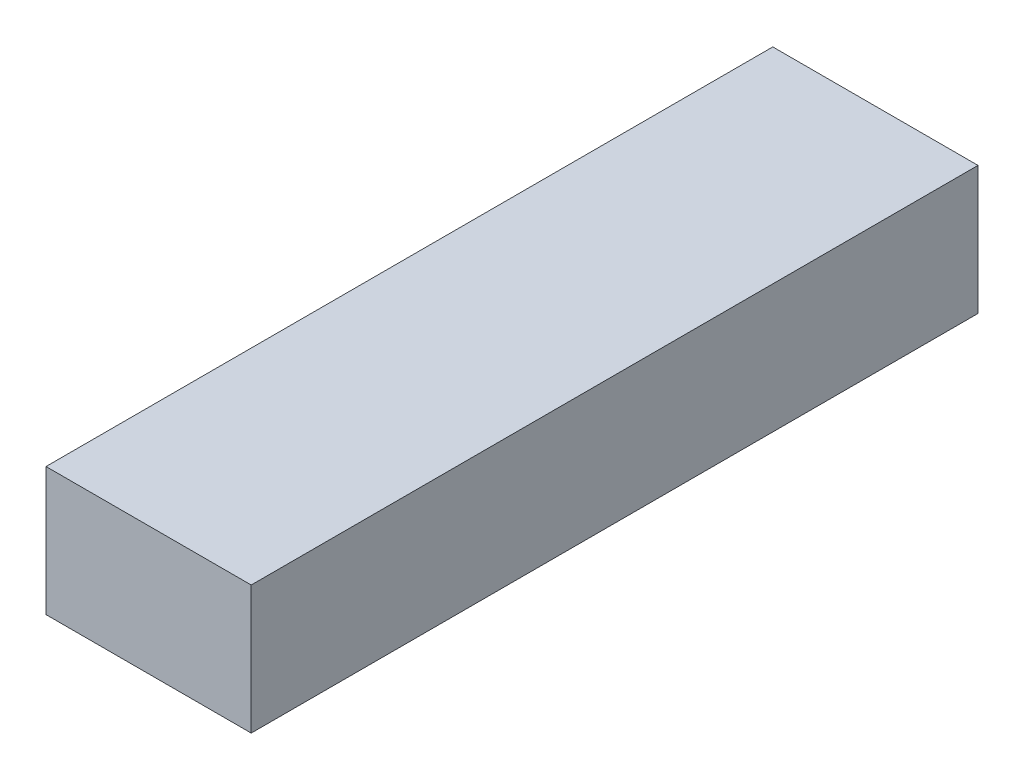
ISO-10303-21;
HEADER;
FILE_DESCRIPTION(('STEP AP214'),'2;1');
FILE_NAME('part.step','',(''),(''),'','','');
FILE_SCHEMA(('AUTOMOTIVE_DESIGN { 1 0 10303 214 1 1 1 1 }'));
ENDSEC;
DATA;
#1=APPLICATION_CONTEXT('core data for automotive mechanical design processes');
#2=APPLICATION_PROTOCOL_DEFINITION('international standard','automotive_design',2000,#1);
#3=PRODUCT_CONTEXT('',#1,'mechanical');
#4=PRODUCT('Part','Part','',(#3));
#5=PRODUCT_RELATED_PRODUCT_CATEGORY('part','',(#4));
#6=PRODUCT_DEFINITION_FORMATION('','',#4);
#7=PRODUCT_DEFINITION_CONTEXT('part definition',#1,'design');
#8=PRODUCT_DEFINITION('design','',#6,#7);
#9=PRODUCT_DEFINITION_SHAPE('','',#8);
#10=(LENGTH_UNIT() NAMED_UNIT(*) SI_UNIT(.MILLI.,.METRE.));
#11=(NAMED_UNIT(*) PLANE_ANGLE_UNIT() SI_UNIT($,.RADIAN.));
#12=(NAMED_UNIT(*) SI_UNIT($,.STERADIAN.) SOLID_ANGLE_UNIT());
#13=UNCERTAINTY_MEASURE_WITH_UNIT(LENGTH_MEASURE(1.E-05),#10,'distance_accuracy_value','');
#14=(GEOMETRIC_REPRESENTATION_CONTEXT(3) GLOBAL_UNCERTAINTY_ASSIGNED_CONTEXT((#13)) GLOBAL_UNIT_ASSIGNED_CONTEXT((#10,
#11,#12)) REPRESENTATION_CONTEXT('',''));
#15=CARTESIAN_POINT('',(0.,0.,0.));
#16=DIRECTION('',(0.,0.,1.));
#17=DIRECTION('',(1.,0.,0.));
#18=AXIS2_PLACEMENT_3D('',#15,#16,#17);
#19=CARTESIAN_POINT('',(24.,15.,170.));
#20=DIRECTION('',(-1.,0.,0.));
#21=DIRECTION('',(0.,0.,1.));
#22=AXIS2_PLACEMENT_3D('',#19,#20,#21);
#23=PLANE('',#22);
#24=DIRECTION('',(0.,1.,0.));
#25=VECTOR('',#24,1.);
#26=CARTESIAN_POINT('',(24.,15.,0.));
#27=LINE('',#26,#25);
#28=CARTESIAN_POINT('',(24.,-15.,0.));
#29=VERTEX_POINT('',#28);
#30=CARTESIAN_POINT('',(24.,15.,0.));
#31=VERTEX_POINT('',#30);
#32=EDGE_CURVE('E104',#29,#31,#27,.T.);
#33=ORIENTED_EDGE('',*,*,#32,.T.);
#34=DIRECTION('',(0.,0.,-1.));
#35=VECTOR('',#34,1.);
#36=CARTESIAN_POINT('',(24.,15.,170.));
#37=LINE('',#36,#35);
#38=CARTESIAN_POINT('',(24.,15.,170.));
#39=VERTEX_POINT('',#38);
#40=EDGE_CURVE('E11',#39,#31,#37,.T.);
#41=ORIENTED_EDGE('',*,*,#40,.F.);
#42=DIRECTION('',(0.,1.,0.));
#43=VECTOR('',#42,1.);
#44=CARTESIAN_POINT('',(24.,15.,170.));
#45=LINE('',#44,#43);
#46=CARTESIAN_POINT('',(24.,-15.,170.));
#47=VERTEX_POINT('',#46);
#48=EDGE_CURVE('E92',#47,#39,#45,.T.);
#49=ORIENTED_EDGE('',*,*,#48,.F.);
#50=DIRECTION('',(0.,0.,-1.));
#51=VECTOR('',#50,1.);
#52=CARTESIAN_POINT('',(24.,-15.,170.));
#53=LINE('',#52,#51);
#54=EDGE_CURVE('E100',#47,#29,#53,.T.);
#55=ORIENTED_EDGE('',*,*,#54,.T.);
#56=EDGE_LOOP('',(#33,#41,#49,#55));
#57=FACE_BOUND('',#56,.T.);
#58=ADVANCED_FACE('F41',(#57),#23,.F.);
#59=CARTESIAN_POINT('',(-24.,15.,170.));
#60=DIRECTION('',(0.,-1.,0.));
#61=DIRECTION('',(0.,0.,-1.));
#62=AXIS2_PLACEMENT_3D('',#59,#60,#61);
#63=PLANE('',#62);
#64=DIRECTION('',(-1.,0.,0.));
#65=VECTOR('',#64,1.);
#66=CARTESIAN_POINT('',(-24.,15.,0.));
#67=LINE('',#66,#65);
#68=CARTESIAN_POINT('',(-24.,15.,0.));
#69=VERTEX_POINT('',#68);
#70=EDGE_CURVE('E96',#31,#69,#67,.T.);
#71=ORIENTED_EDGE('',*,*,#70,.T.);
#72=DIRECTION('',(0.,0.,-1.));
#73=VECTOR('',#72,1.);
#74=CARTESIAN_POINT('',(-24.,15.,170.));
#75=LINE('',#74,#73);
#76=CARTESIAN_POINT('',(-24.,15.,170.));
#77=VERTEX_POINT('',#76);
#78=EDGE_CURVE('E49',#77,#69,#75,.T.);
#79=ORIENTED_EDGE('',*,*,#78,.F.);
#80=DIRECTION('',(-1.,0.,0.));
#81=VECTOR('',#80,1.);
#82=CARTESIAN_POINT('',(-24.,15.,170.));
#83=LINE('',#82,#81);
#84=EDGE_CURVE('E87',#39,#77,#83,.T.);
#85=ORIENTED_EDGE('',*,*,#84,.F.);
#86=ORIENTED_EDGE('',*,*,#40,.T.);
#87=EDGE_LOOP('',(#71,#79,#85,#86));
#88=FACE_BOUND('',#87,.T.);
#89=ADVANCED_FACE('F95',(#88),#63,.F.);
#90=CARTESIAN_POINT('',(-24.,15.,170.));
#91=DIRECTION('',(1.,0.,0.));
#92=DIRECTION('',(0.,1.,0.));
#93=AXIS2_PLACEMENT_3D('',#90,#91,#92);
#94=PLANE('',#93);
#95=DIRECTION('',(0.,-1.,0.));
#96=VECTOR('',#95,1.);
#97=CARTESIAN_POINT('',(-24.,15.,0.));
#98=LINE('',#97,#96);
#99=CARTESIAN_POINT('',(-24.,-15.,0.));
#100=VERTEX_POINT('',#99);
#101=EDGE_CURVE('E74',#69,#100,#98,.T.);
#102=ORIENTED_EDGE('',*,*,#101,.T.);
#103=DIRECTION('',(0.,0.,-1.));
#104=VECTOR('',#103,1.);
#105=CARTESIAN_POINT('',(-24.,-15.,170.));
#106=LINE('',#105,#104);
#107=CARTESIAN_POINT('',(-24.,-15.,170.));
#108=VERTEX_POINT('',#107);
#109=EDGE_CURVE('E97',#108,#100,#106,.T.);
#110=ORIENTED_EDGE('',*,*,#109,.F.);
#111=DIRECTION('',(0.,-1.,0.));
#112=VECTOR('',#111,1.);
#113=CARTESIAN_POINT('',(-24.,15.,170.));
#114=LINE('',#113,#112);
#115=EDGE_CURVE('E90',#77,#108,#114,.T.);
#116=ORIENTED_EDGE('',*,*,#115,.F.);
#117=ORIENTED_EDGE('',*,*,#78,.T.);
#118=EDGE_LOOP('',(#102,#110,#116,#117));
#119=FACE_BOUND('',#118,.T.);
#120=ADVANCED_FACE('F98',(#119),#94,.F.);
#121=CARTESIAN_POINT('',(-24.,-15.,170.));
#122=DIRECTION('',(0.,1.,0.));
#123=DIRECTION('',(0.,0.,1.));
#124=AXIS2_PLACEMENT_3D('',#121,#122,#123);
#125=PLANE('',#124);
#126=DIRECTION('',(1.,0.,0.));
#127=VECTOR('',#126,1.);
#128=CARTESIAN_POINT('',(-24.,-15.,0.));
#129=LINE('',#128,#127);
#130=EDGE_CURVE('E80',#100,#29,#129,.T.);
#131=ORIENTED_EDGE('',*,*,#130,.T.);
#132=ORIENTED_EDGE('',*,*,#54,.F.);
#133=DIRECTION('',(1.,0.,0.));
#134=VECTOR('',#133,1.);
#135=CARTESIAN_POINT('',(-24.,-15.,170.));
#136=LINE('',#135,#134);
#137=EDGE_CURVE('E57',#108,#47,#136,.T.);
#138=ORIENTED_EDGE('',*,*,#137,.F.);
#139=ORIENTED_EDGE('',*,*,#109,.T.);
#140=EDGE_LOOP('',(#131,#132,#138,#139));
#141=FACE_BOUND('',#140,.T.);
#142=ADVANCED_FACE('F111',(#141),#125,.F.);
#143=CARTESIAN_POINT('',(0.,0.,170.));
#144=DIRECTION('',(0.,0.,1.));
#145=DIRECTION('',(1.,0.,0.));
#146=AXIS2_PLACEMENT_3D('',#143,#144,#145);
#147=PLANE('',#146);
#148=ORIENTED_EDGE('',*,*,#48,.T.);
#149=ORIENTED_EDGE('',*,*,#84,.T.);
#150=ORIENTED_EDGE('',*,*,#115,.T.);
#151=ORIENTED_EDGE('',*,*,#137,.T.);
#152=EDGE_LOOP('',(#148,#149,#150,#151));
#153=FACE_BOUND('',#152,.T.);
#154=ADVANCED_FACE('F88',(#153),#147,.T.);
#155=CARTESIAN_POINT('',(0.,0.,0.));
#156=DIRECTION('',(0.,0.,1.));
#157=DIRECTION('',(1.,0.,0.));
#158=AXIS2_PLACEMENT_3D('',#155,#156,#157);
#159=PLANE('',#158);
#160=ORIENTED_EDGE('',*,*,#32,.F.);
#161=ORIENTED_EDGE('',*,*,#130,.F.);
#162=ORIENTED_EDGE('',*,*,#101,.F.);
#163=ORIENTED_EDGE('',*,*,#70,.F.);
#164=EDGE_LOOP('',(#160,#161,#162,#163));
#165=FACE_BOUND('',#164,.T.);
#166=ADVANCED_FACE('F114',(#165),#159,.F.);
#167=CLOSED_SHELL('',(#58,#89,#120,#142,#154,#166));
#168=MANIFOLD_SOLID_BREP('B2',#167);
#169=ADVANCED_BREP_SHAPE_REPRESENTATION('',(#18,#168),#14);
#170=SHAPE_DEFINITION_REPRESENTATION(#9,#169);
ENDSEC;
END-ISO-10303-21;
